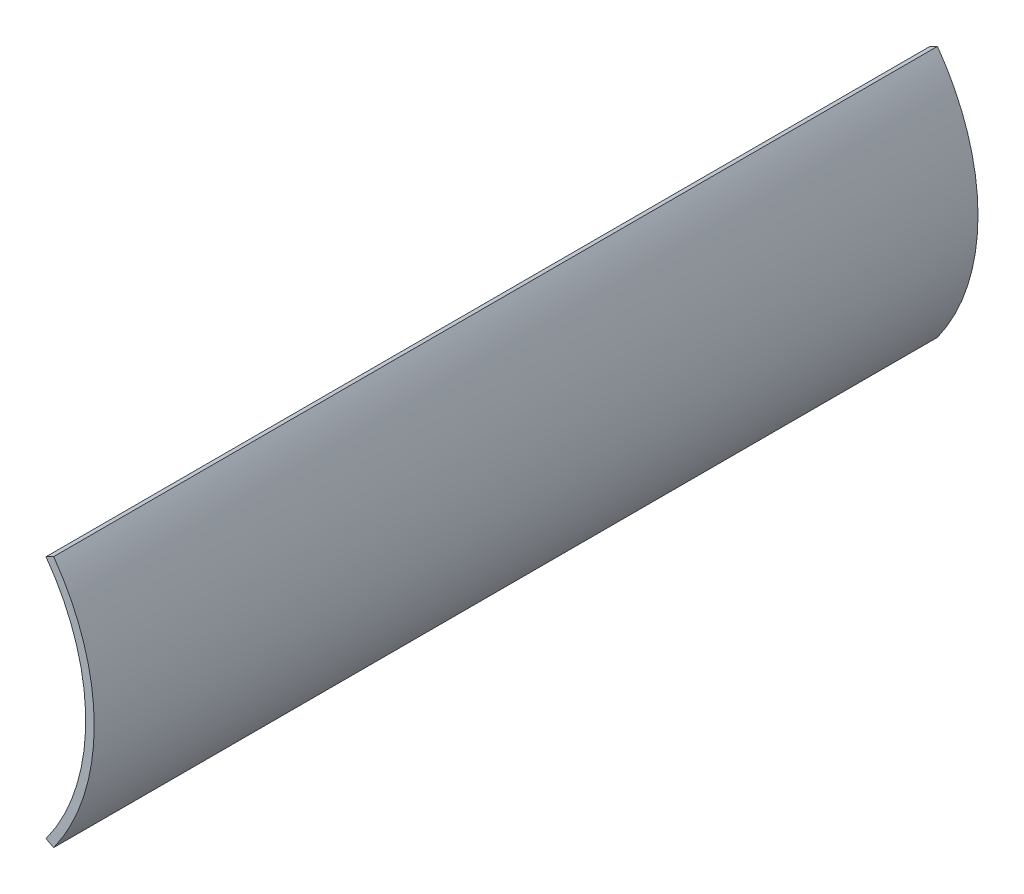
ISO-10303-21;
HEADER;
FILE_DESCRIPTION(('STEP AP214'),'2;1');
FILE_NAME('part.step','',(''),(''),'','','');
FILE_SCHEMA(('AUTOMOTIVE_DESIGN { 1 0 10303 214 1 1 1 1 }'));
ENDSEC;
DATA;
#1=APPLICATION_CONTEXT('core data for automotive mechanical design processes');
#2=APPLICATION_PROTOCOL_DEFINITION('international standard','automotive_design',2000,#1);
#3=PRODUCT_CONTEXT('',#1,'mechanical');
#4=PRODUCT('Part','Part','',(#3));
#5=PRODUCT_RELATED_PRODUCT_CATEGORY('part','',(#4));
#6=PRODUCT_DEFINITION_FORMATION('','',#4);
#7=PRODUCT_DEFINITION_CONTEXT('part definition',#1,'design');
#8=PRODUCT_DEFINITION('design','',#6,#7);
#9=PRODUCT_DEFINITION_SHAPE('','',#8);
#10=(LENGTH_UNIT() NAMED_UNIT(*) SI_UNIT(.MILLI.,.METRE.));
#11=(NAMED_UNIT(*) PLANE_ANGLE_UNIT() SI_UNIT($,.RADIAN.));
#12=(NAMED_UNIT(*) SI_UNIT($,.STERADIAN.) SOLID_ANGLE_UNIT());
#13=UNCERTAINTY_MEASURE_WITH_UNIT(LENGTH_MEASURE(1.E-05),#10,'distance_accuracy_value','');
#14=(GEOMETRIC_REPRESENTATION_CONTEXT(3) GLOBAL_UNCERTAINTY_ASSIGNED_CONTEXT((#13)) GLOBAL_UNIT_ASSIGNED_CONTEXT((#10,
#11,#12)) REPRESENTATION_CONTEXT('',''));
#15=CARTESIAN_POINT('',(0.,0.,0.));
#16=DIRECTION('',(0.,0.,1.));
#17=DIRECTION('',(1.,0.,0.));
#18=AXIS2_PLACEMENT_3D('',#15,#16,#17);
#19=CARTESIAN_POINT('',(-43.649290990986,0.230827675433825,208.));
#20=DIRECTION('',(0.,0.,-1.));
#21=DIRECTION('',(-1.,0.,0.));
#22=AXIS2_PLACEMENT_3D('',#19,#20,#21);
#23=CYLINDRICAL_SURFACE('',#22,48.8374802224702);
#24=CARTESIAN_POINT('',(-43.649290990986,0.230827675433825,0.));
#25=DIRECTION('',(0.,0.,-1.));
#26=DIRECTION('',(-1.,0.,0.));
#27=AXIS2_PLACEMENT_3D('',#24,#25,#26);
#28=CIRCLE('',#27,48.8374802224702);
#29=CARTESIAN_POINT('',(-4.1594128493454,28.9649363067894,0.));
#30=VERTEX_POINT('',#29);
#31=CARTESIAN_POINT('',(-4.1594116642822,-28.5032793272649,0.));
#32=VERTEX_POINT('',#31);
#33=EDGE_CURVE('E106',#30,#32,#28,.T.);
#34=ORIENTED_EDGE('',*,*,#33,.T.);
#35=DIRECTION('',(0.,0.,-1.));
#36=VECTOR('',#35,1.);
#37=CARTESIAN_POINT('',(-4.1594116642822,-28.5032793272649,208.));
#38=LINE('',#37,#36);
#39=CARTESIAN_POINT('',(-4.1594116642822,-28.5032793272649,208.));
#40=VERTEX_POINT('',#39);
#41=EDGE_CURVE('E11',#40,#32,#38,.T.);
#42=ORIENTED_EDGE('',*,*,#41,.F.);
#43=CARTESIAN_POINT('',(-43.649290990986,0.230827675433825,208.));
#44=DIRECTION('',(0.,0.,-1.));
#45=DIRECTION('',(-1.,0.,0.));
#46=AXIS2_PLACEMENT_3D('',#43,#44,#45);
#47=CIRCLE('',#46,48.8374802224702);
#48=CARTESIAN_POINT('',(-4.1594128493454,28.9649363067894,208.));
#49=VERTEX_POINT('',#48);
#50=EDGE_CURVE('E94',#49,#40,#47,.T.);
#51=ORIENTED_EDGE('',*,*,#50,.F.);
#52=DIRECTION('',(0.,0.,-1.));
#53=VECTOR('',#52,1.);
#54=CARTESIAN_POINT('',(-4.1594128493454,28.9649363067894,208.));
#55=LINE('',#54,#53);
#56=EDGE_CURVE('E102',#49,#30,#55,.T.);
#57=ORIENTED_EDGE('',*,*,#56,.T.);
#58=EDGE_LOOP('',(#34,#42,#51,#57));
#59=FACE_BOUND('',#58,.T.);
#60=ADVANCED_FACE('F43',(#59),#23,.F.);
#61=CARTESIAN_POINT('',(-4.1594116642822,-28.5032793272649,208.));
#62=DIRECTION('',(0.456373396903706,0.889788358318186,0.));
#63=DIRECTION('',(-0.889788358318186,0.456373396903706,0.));
#64=AXIS2_PLACEMENT_3D('',#61,#62,#63);
#65=PLANE('',#64);
#66=DIRECTION('',(0.889788358318186,-0.456373396903706,0.));
#67=VECTOR('',#66,1.);
#68=CARTESIAN_POINT('',(-4.1594116642822,-28.5032793272649,0.));
#69=LINE('',#68,#67);
#70=CARTESIAN_POINT('',(-2.35907448776058,-29.4266741830643,0.));
#71=VERTEX_POINT('',#70);
#72=EDGE_CURVE('E98',#32,#71,#69,.T.);
#73=ORIENTED_EDGE('',*,*,#72,.T.);
#74=DIRECTION('',(0.,0.,-1.));
#75=VECTOR('',#74,1.);
#76=CARTESIAN_POINT('',(-2.35907448776058,-29.4266741830643,208.));
#77=LINE('',#76,#75);
#78=CARTESIAN_POINT('',(-2.35907448776058,-29.4266741830643,208.));
#79=VERTEX_POINT('',#78);
#80=EDGE_CURVE('E51',#79,#71,#77,.T.);
#81=ORIENTED_EDGE('',*,*,#80,.F.);
#82=DIRECTION('',(0.889788358318186,-0.456373396903706,0.));
#83=VECTOR('',#82,1.);
#84=CARTESIAN_POINT('',(-4.1594116642822,-28.5032793272649,208.));
#85=LINE('',#84,#83);
#86=EDGE_CURVE('E89',#40,#79,#85,.T.);
#87=ORIENTED_EDGE('',*,*,#86,.F.);
#88=ORIENTED_EDGE('',*,*,#41,.T.);
#89=EDGE_LOOP('',(#73,#81,#87,#88));
#90=FACE_BOUND('',#89,.T.);
#91=ADVANCED_FACE('F97',(#90),#65,.F.);
#92=CARTESIAN_POINT('',(-43.649290990986,0.230827675433825,208.));
#93=DIRECTION('',(0.,0.,-1.));
#94=DIRECTION('',(-1.,0.,0.));
#95=AXIS2_PLACEMENT_3D('',#92,#93,#94);
#96=CYLINDRICAL_SURFACE('',#95,50.8374802224702);
#97=CARTESIAN_POINT('',(-43.649290990986,0.230827675433825,0.));
#98=DIRECTION('',(0.,0.,1.));
#99=DIRECTION('',(1.,0.,0.));
#100=AXIS2_PLACEMENT_3D('',#97,#98,#99);
#101=CIRCLE('',#100,50.8374802224702);
#102=CARTESIAN_POINT('',(-2.35907566168036,29.8883311683043,0.));
#103=VERTEX_POINT('',#102);
#104=EDGE_CURVE('E76',#71,#103,#101,.T.);
#105=ORIENTED_EDGE('',*,*,#104,.T.);
#106=DIRECTION('',(0.,0.,-1.));
#107=VECTOR('',#106,1.);
#108=CARTESIAN_POINT('',(-2.35907566168036,29.8883311683043,208.));
#109=LINE('',#108,#107);
#110=CARTESIAN_POINT('',(-2.35907566168036,29.8883311683043,208.));
#111=VERTEX_POINT('',#110);
#112=EDGE_CURVE('E99',#111,#103,#109,.T.);
#113=ORIENTED_EDGE('',*,*,#112,.F.);
#114=CARTESIAN_POINT('',(-43.649290990986,0.230827675433825,208.));
#115=DIRECTION('',(0.,0.,1.));
#116=DIRECTION('',(1.,0.,0.));
#117=AXIS2_PLACEMENT_3D('',#114,#115,#116);
#118=CIRCLE('',#117,50.8374802224702);
#119=EDGE_CURVE('E92',#79,#111,#118,.T.);
#120=ORIENTED_EDGE('',*,*,#119,.F.);
#121=ORIENTED_EDGE('',*,*,#80,.T.);
#122=EDGE_LOOP('',(#105,#113,#120,#121));
#123=FACE_BOUND('',#122,.T.);
#124=ADVANCED_FACE('F100',(#123),#96,.T.);
#125=CARTESIAN_POINT('',(-4.1594128493454,28.9649363067894,208.));
#126=DIRECTION('',(0.456373396903706,-0.889788358318186,0.));
#127=DIRECTION('',(0.889788358318186,0.456373396903706,0.));
#128=AXIS2_PLACEMENT_3D('',#125,#126,#127);
#129=PLANE('',#128);
#130=DIRECTION('',(-0.889788358318186,-0.456373396903706,0.));
#131=VECTOR('',#130,1.);
#132=CARTESIAN_POINT('',(-4.1594128493454,28.9649363067894,0.));
#133=LINE('',#132,#131);
#134=EDGE_CURVE('E82',#103,#30,#133,.T.);
#135=ORIENTED_EDGE('',*,*,#134,.T.);
#136=ORIENTED_EDGE('',*,*,#56,.F.);
#137=DIRECTION('',(-0.889788358318186,-0.456373396903706,0.));
#138=VECTOR('',#137,1.);
#139=CARTESIAN_POINT('',(-4.1594128493454,28.9649363067894,208.));
#140=LINE('',#139,#138);
#141=EDGE_CURVE('E59',#111,#49,#140,.T.);
#142=ORIENTED_EDGE('',*,*,#141,.F.);
#143=ORIENTED_EDGE('',*,*,#112,.T.);
#144=EDGE_LOOP('',(#135,#136,#142,#143));
#145=FACE_BOUND('',#144,.T.);
#146=ADVANCED_FACE('F113',(#145),#129,.F.);
#147=CARTESIAN_POINT('',(-43.649290990986,0.230827675433825,208.));
#148=DIRECTION('',(0.,0.,-1.));
#149=DIRECTION('',(-1.,0.,0.));
#150=AXIS2_PLACEMENT_3D('',#147,#148,#149);
#151=PLANE('',#150);
#152=ORIENTED_EDGE('',*,*,#50,.T.);
#153=ORIENTED_EDGE('',*,*,#86,.T.);
#154=ORIENTED_EDGE('',*,*,#119,.T.);
#155=ORIENTED_EDGE('',*,*,#141,.T.);
#156=EDGE_LOOP('',(#152,#153,#154,#155));
#157=FACE_BOUND('',#156,.T.);
#158=ADVANCED_FACE('F90',(#157),#151,.F.);
#159=CARTESIAN_POINT('',(-43.649290990986,0.230827675433825,0.));
#160=DIRECTION('',(0.,0.,-1.));
#161=DIRECTION('',(-1.,0.,0.));
#162=AXIS2_PLACEMENT_3D('',#159,#160,#161);
#163=PLANE('',#162);
#164=ORIENTED_EDGE('',*,*,#33,.F.);
#165=ORIENTED_EDGE('',*,*,#134,.F.);
#166=ORIENTED_EDGE('',*,*,#104,.F.);
#167=ORIENTED_EDGE('',*,*,#72,.F.);
#168=EDGE_LOOP('',(#164,#165,#166,#167));
#169=FACE_BOUND('',#168,.T.);
#170=ADVANCED_FACE('F116',(#169),#163,.T.);
#171=CLOSED_SHELL('',(#60,#91,#124,#146,#158,#170));
#172=MANIFOLD_SOLID_BREP('B2',#171);
#173=ADVANCED_BREP_SHAPE_REPRESENTATION('',(#18,#172),#14);
#174=SHAPE_DEFINITION_REPRESENTATION(#9,#173);
ENDSEC;
END-ISO-10303-21;
